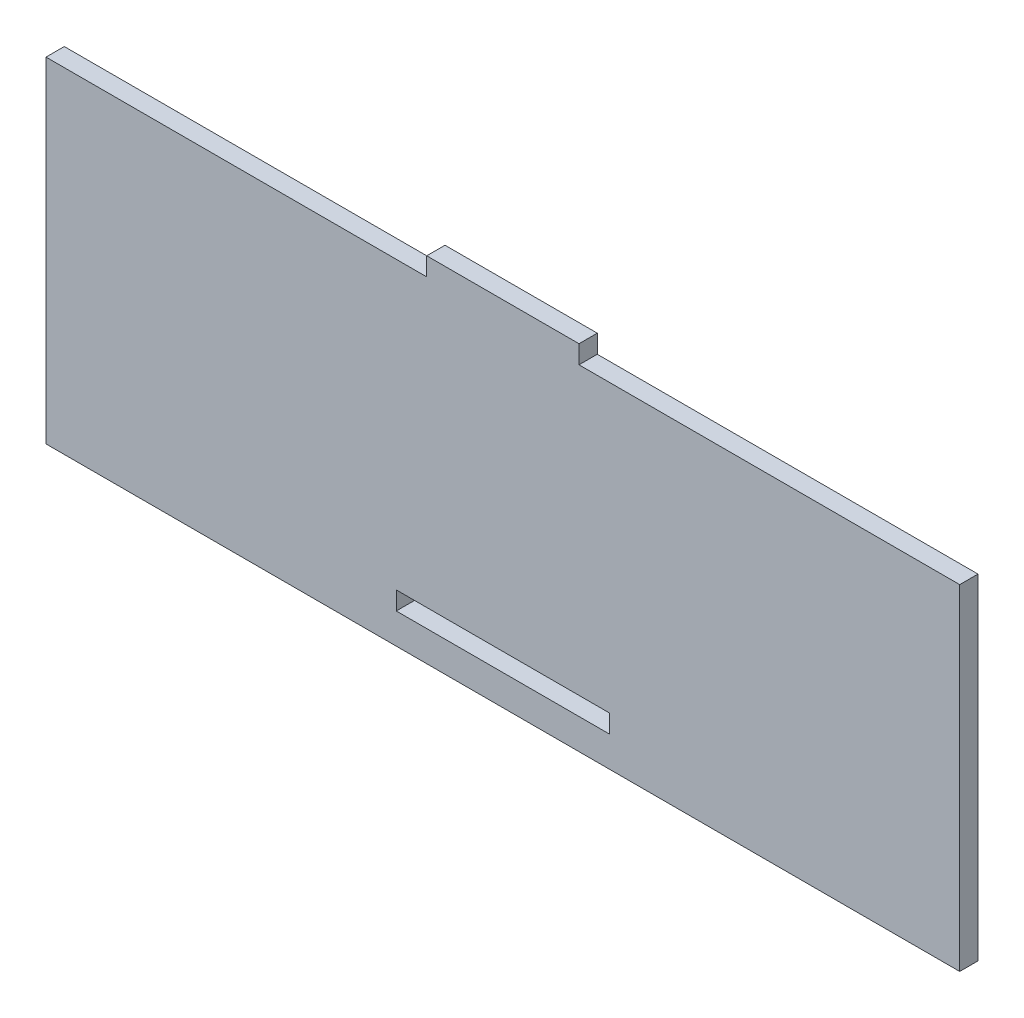
ISO-10303-21;
HEADER;
FILE_DESCRIPTION(('STEP AP214'),'2;1');
FILE_NAME('part.step','',(''),(''),'','','');
FILE_SCHEMA(('AUTOMOTIVE_DESIGN { 1 0 10303 214 1 1 1 1 }'));
ENDSEC;
DATA;
#1=APPLICATION_CONTEXT('core data for automotive mechanical design processes');
#2=APPLICATION_PROTOCOL_DEFINITION('international standard','automotive_design',2000,#1);
#3=PRODUCT_CONTEXT('',#1,'mechanical');
#4=PRODUCT('Part','Part','',(#3));
#5=PRODUCT_RELATED_PRODUCT_CATEGORY('part','',(#4));
#6=PRODUCT_DEFINITION_FORMATION('','',#4);
#7=PRODUCT_DEFINITION_CONTEXT('part definition',#1,'design');
#8=PRODUCT_DEFINITION('design','',#6,#7);
#9=PRODUCT_DEFINITION_SHAPE('','',#8);
#10=(LENGTH_UNIT() NAMED_UNIT(*) SI_UNIT(.MILLI.,.METRE.));
#11=(NAMED_UNIT(*) PLANE_ANGLE_UNIT() SI_UNIT($,.RADIAN.));
#12=(NAMED_UNIT(*) SI_UNIT($,.STERADIAN.) SOLID_ANGLE_UNIT());
#13=UNCERTAINTY_MEASURE_WITH_UNIT(LENGTH_MEASURE(1.E-05),#10,'distance_accuracy_value','');
#14=(GEOMETRIC_REPRESENTATION_CONTEXT(3) GLOBAL_UNCERTAINTY_ASSIGNED_CONTEXT((#13)) GLOBAL_UNIT_ASSIGNED_CONTEXT((#10,
#11,#12)) REPRESENTATION_CONTEXT('',''));
#15=CARTESIAN_POINT('',(0.,0.,0.));
#16=DIRECTION('',(0.,0.,1.));
#17=DIRECTION('',(1.,0.,0.));
#18=AXIS2_PLACEMENT_3D('',#15,#16,#17);
#19=CARTESIAN_POINT('',(0.,0.,3.));
#20=DIRECTION('',(0.,0.,1.));
#21=DIRECTION('',(1.,0.,0.));
#22=AXIS2_PLACEMENT_3D('',#19,#20,#21);
#23=PLANE('',#22);
#24=DIRECTION('',(0.,-1.,0.));
#25=VECTOR('',#24,1.);
#26=CARTESIAN_POINT('',(-73.2843137254903,61.3464052287582,3.));
#27=LINE('',#26,#25);
#28=CARTESIAN_POINT('',(-73.2843137254903,61.3464052287582,3.));
#29=VERTEX_POINT('',#28);
#30=CARTESIAN_POINT('',(-73.2843137254903,6.3464052287582,3.));
#31=VERTEX_POINT('',#30);
#32=EDGE_CURVE('E158',#29,#31,#27,.T.);
#33=ORIENTED_EDGE('',*,*,#32,.T.);
#34=DIRECTION('',(1.,0.,0.));
#35=VECTOR('',#34,1.);
#36=CARTESIAN_POINT('',(-73.2843137254903,6.3464052287582,3.));
#37=LINE('',#36,#35);
#38=CARTESIAN_POINT('',(76.7156862745097,6.3464052287582,3.));
#39=VERTEX_POINT('',#38);
#40=EDGE_CURVE('E161',#31,#39,#37,.T.);
#41=ORIENTED_EDGE('',*,*,#40,.T.);
#42=DIRECTION('',(0.,1.,0.));
#43=VECTOR('',#42,1.);
#44=CARTESIAN_POINT('',(76.7156862745097,61.3464052287582,3.));
#45=LINE('',#44,#43);
#46=CARTESIAN_POINT('',(76.7156862745097,61.3464052287582,3.));
#47=VERTEX_POINT('',#46);
#48=EDGE_CURVE('E164',#39,#47,#45,.T.);
#49=ORIENTED_EDGE('',*,*,#48,.T.);
#50=DIRECTION('',(-1.,0.,0.));
#51=VECTOR('',#50,1.);
#52=CARTESIAN_POINT('',(14.2156862745097,61.3464052287582,3.));
#53=LINE('',#52,#51);
#54=CARTESIAN_POINT('',(14.2156862745097,61.3464052287582,3.));
#55=VERTEX_POINT('',#54);
#56=EDGE_CURVE('E166',#47,#55,#53,.T.);
#57=ORIENTED_EDGE('',*,*,#56,.T.);
#58=DIRECTION('',(0.,1.,0.));
#59=VECTOR('',#58,1.);
#60=CARTESIAN_POINT('',(14.2156862745097,61.3464052287582,3.));
#61=LINE('',#60,#59);
#62=CARTESIAN_POINT('',(14.2156862745097,64.3464052287582,3.));
#63=VERTEX_POINT('',#62);
#64=EDGE_CURVE('E168',#55,#63,#61,.T.);
#65=ORIENTED_EDGE('',*,*,#64,.T.);
#66=DIRECTION('',(-1.,0.,0.));
#67=VECTOR('',#66,1.);
#68=CARTESIAN_POINT('',(-10.7843137254903,64.3464052287582,3.));
#69=LINE('',#68,#67);
#70=CARTESIAN_POINT('',(-10.7843137254903,64.3464052287582,3.));
#71=VERTEX_POINT('',#70);
#72=EDGE_CURVE('E170',#63,#71,#69,.T.);
#73=ORIENTED_EDGE('',*,*,#72,.T.);
#74=DIRECTION('',(0.,-1.,0.));
#75=VECTOR('',#74,1.);
#76=CARTESIAN_POINT('',(-10.7843137254903,61.3464052287582,3.));
#77=LINE('',#76,#75);
#78=CARTESIAN_POINT('',(-10.7843137254903,61.3464052287582,3.));
#79=VERTEX_POINT('',#78);
#80=EDGE_CURVE('E172',#71,#79,#77,.T.);
#81=ORIENTED_EDGE('',*,*,#80,.T.);
#82=DIRECTION('',(-1.,0.,0.));
#83=VECTOR('',#82,1.);
#84=CARTESIAN_POINT('',(-73.2843137254903,61.3464052287582,3.));
#85=LINE('',#84,#83);
#86=EDGE_CURVE('E174',#79,#29,#85,.T.);
#87=ORIENTED_EDGE('',*,*,#86,.T.);
#88=EDGE_LOOP('',(#33,#41,#49,#57,#65,#73,#81,#87));
#89=FACE_BOUND('',#88,.T.);
#90=DIRECTION('',(1.,0.,0.));
#91=VECTOR('',#90,1.);
#92=CARTESIAN_POINT('',(-15.7843137254903,11.3464052287582,3.));
#93=LINE('',#92,#91);
#94=CARTESIAN_POINT('',(-15.7843137254903,11.3464052287582,3.));
#95=VERTEX_POINT('',#94);
#96=CARTESIAN_POINT('',(19.2156862745097,11.3464052287582,3.));
#97=VERTEX_POINT('',#96);
#98=EDGE_CURVE('E130',#95,#97,#93,.T.);
#99=ORIENTED_EDGE('',*,*,#98,.F.);
#100=DIRECTION('',(0.,-1.,0.));
#101=VECTOR('',#100,1.);
#102=CARTESIAN_POINT('',(-15.7843137254903,11.3464052287582,3.));
#103=LINE('',#102,#101);
#104=CARTESIAN_POINT('',(-15.7843137254903,14.3464052287582,3.));
#105=VERTEX_POINT('',#104);
#106=EDGE_CURVE('E122',#105,#95,#103,.T.);
#107=ORIENTED_EDGE('',*,*,#106,.F.);
#108=DIRECTION('',(-1.,0.,0.));
#109=VECTOR('',#108,1.);
#110=CARTESIAN_POINT('',(-15.7843137254903,14.3464052287582,3.));
#111=LINE('',#110,#109);
#112=CARTESIAN_POINT('',(19.2156862745097,14.3464052287582,3.));
#113=VERTEX_POINT('',#112);
#114=EDGE_CURVE('E144',#113,#105,#111,.T.);
#115=ORIENTED_EDGE('',*,*,#114,.F.);
#116=DIRECTION('',(0.,1.,0.));
#117=VECTOR('',#116,1.);
#118=CARTESIAN_POINT('',(19.2156862745097,11.3464052287582,3.));
#119=LINE('',#118,#117);
#120=EDGE_CURVE('E142',#97,#113,#119,.T.);
#121=ORIENTED_EDGE('',*,*,#120,.F.);
#122=EDGE_LOOP('',(#99,#107,#115,#121));
#123=FACE_BOUND('',#122,.T.);
#124=ADVANCED_FACE('F33',(#89,#123),#23,.T.);
#125=CARTESIAN_POINT('',(0.,0.,0.));
#126=DIRECTION('',(0.,0.,1.));
#127=DIRECTION('',(1.,0.,0.));
#128=AXIS2_PLACEMENT_3D('',#125,#126,#127);
#129=PLANE('',#128);
#130=DIRECTION('',(0.,-1.,0.));
#131=VECTOR('',#130,1.);
#132=CARTESIAN_POINT('',(-73.2843137254903,61.3464052287582,0.));
#133=LINE('',#132,#131);
#134=CARTESIAN_POINT('',(-73.2843137254903,61.3464052287582,0.));
#135=VERTEX_POINT('',#134);
#136=CARTESIAN_POINT('',(-73.2843137254903,6.3464052287582,0.));
#137=VERTEX_POINT('',#136);
#138=EDGE_CURVE('E138',#135,#137,#133,.T.);
#139=ORIENTED_EDGE('',*,*,#138,.F.);
#140=DIRECTION('',(-1.,0.,0.));
#141=VECTOR('',#140,1.);
#142=CARTESIAN_POINT('',(-73.2843137254903,61.3464052287582,0.));
#143=LINE('',#142,#141);
#144=CARTESIAN_POINT('',(-10.7843137254903,61.3464052287582,0.));
#145=VERTEX_POINT('',#144);
#146=EDGE_CURVE('E162',#145,#135,#143,.T.);
#147=ORIENTED_EDGE('',*,*,#146,.F.);
#148=DIRECTION('',(0.,-1.,0.));
#149=VECTOR('',#148,1.);
#150=CARTESIAN_POINT('',(-10.7843137254903,61.3464052287582,0.));
#151=LINE('',#150,#149);
#152=CARTESIAN_POINT('',(-10.7843137254903,64.3464052287582,0.));
#153=VERTEX_POINT('',#152);
#154=EDGE_CURVE('E189',#153,#145,#151,.T.);
#155=ORIENTED_EDGE('',*,*,#154,.F.);
#156=DIRECTION('',(-1.,0.,0.));
#157=VECTOR('',#156,1.);
#158=CARTESIAN_POINT('',(-10.7843137254903,64.3464052287582,0.));
#159=LINE('',#158,#157);
#160=CARTESIAN_POINT('',(14.2156862745097,64.3464052287582,0.));
#161=VERTEX_POINT('',#160);
#162=EDGE_CURVE('E187',#161,#153,#159,.T.);
#163=ORIENTED_EDGE('',*,*,#162,.F.);
#164=DIRECTION('',(0.,1.,0.));
#165=VECTOR('',#164,1.);
#166=CARTESIAN_POINT('',(14.2156862745097,61.3464052287582,0.));
#167=LINE('',#166,#165);
#168=CARTESIAN_POINT('',(14.2156862745097,61.3464052287582,0.));
#169=VERTEX_POINT('',#168);
#170=EDGE_CURVE('E185',#169,#161,#167,.T.);
#171=ORIENTED_EDGE('',*,*,#170,.F.);
#172=DIRECTION('',(-1.,0.,0.));
#173=VECTOR('',#172,1.);
#174=CARTESIAN_POINT('',(14.2156862745097,61.3464052287582,0.));
#175=LINE('',#174,#173);
#176=CARTESIAN_POINT('',(76.7156862745097,61.3464052287582,0.));
#177=VERTEX_POINT('',#176);
#178=EDGE_CURVE('E183',#177,#169,#175,.T.);
#179=ORIENTED_EDGE('',*,*,#178,.F.);
#180=DIRECTION('',(0.,1.,0.));
#181=VECTOR('',#180,1.);
#182=CARTESIAN_POINT('',(76.7156862745097,61.3464052287582,0.));
#183=LINE('',#182,#181);
#184=CARTESIAN_POINT('',(76.7156862745097,6.3464052287582,0.));
#185=VERTEX_POINT('',#184);
#186=EDGE_CURVE('E181',#185,#177,#183,.T.);
#187=ORIENTED_EDGE('',*,*,#186,.F.);
#188=DIRECTION('',(1.,0.,0.));
#189=VECTOR('',#188,1.);
#190=CARTESIAN_POINT('',(-73.2843137254903,6.3464052287582,0.));
#191=LINE('',#190,#189);
#192=EDGE_CURVE('E179',#137,#185,#191,.T.);
#193=ORIENTED_EDGE('',*,*,#192,.F.);
#194=EDGE_LOOP('',(#139,#147,#155,#163,#171,#179,#187,#193));
#195=FACE_BOUND('',#194,.T.);
#196=DIRECTION('',(0.,-1.,0.));
#197=VECTOR('',#196,1.);
#198=CARTESIAN_POINT('',(-15.7843137254903,11.3464052287582,0.));
#199=LINE('',#198,#197);
#200=CARTESIAN_POINT('',(-15.7843137254903,14.3464052287582,0.));
#201=VERTEX_POINT('',#200);
#202=CARTESIAN_POINT('',(-15.7843137254903,11.3464052287582,0.));
#203=VERTEX_POINT('',#202);
#204=EDGE_CURVE('E56',#201,#203,#199,.T.);
#205=ORIENTED_EDGE('',*,*,#204,.T.);
#206=DIRECTION('',(1.,0.,0.));
#207=VECTOR('',#206,1.);
#208=CARTESIAN_POINT('',(-15.7843137254903,11.3464052287582,0.));
#209=LINE('',#208,#207);
#210=CARTESIAN_POINT('',(19.2156862745097,11.3464052287582,0.));
#211=VERTEX_POINT('',#210);
#212=EDGE_CURVE('E137',#203,#211,#209,.T.);
#213=ORIENTED_EDGE('',*,*,#212,.T.);
#214=DIRECTION('',(0.,1.,0.));
#215=VECTOR('',#214,1.);
#216=CARTESIAN_POINT('',(19.2156862745097,11.3464052287582,0.));
#217=LINE('',#216,#215);
#218=CARTESIAN_POINT('',(19.2156862745097,14.3464052287582,0.));
#219=VERTEX_POINT('',#218);
#220=EDGE_CURVE('E150',#211,#219,#217,.T.);
#221=ORIENTED_EDGE('',*,*,#220,.T.);
#222=DIRECTION('',(-1.,0.,0.));
#223=VECTOR('',#222,1.);
#224=CARTESIAN_POINT('',(-15.7843137254903,14.3464052287582,0.));
#225=LINE('',#224,#223);
#226=EDGE_CURVE('E131',#219,#201,#225,.T.);
#227=ORIENTED_EDGE('',*,*,#226,.T.);
#228=EDGE_LOOP('',(#205,#213,#221,#227));
#229=FACE_BOUND('',#228,.T.);
#230=ADVANCED_FACE('F219',(#195,#229),#129,.F.);
#231=CARTESIAN_POINT('',(-73.2843137254903,61.3464052287582,3.));
#232=DIRECTION('',(1.,0.,0.));
#233=DIRECTION('',(0.,0.,-1.));
#234=AXIS2_PLACEMENT_3D('',#231,#232,#233);
#235=PLANE('',#234);
#236=ORIENTED_EDGE('',*,*,#138,.T.);
#237=DIRECTION('',(0.,0.,-1.));
#238=VECTOR('',#237,1.);
#239=CARTESIAN_POINT('',(-73.2843137254903,6.3464052287582,3.));
#240=LINE('',#239,#238);
#241=EDGE_CURVE('E11',#31,#137,#240,.T.);
#242=ORIENTED_EDGE('',*,*,#241,.F.);
#243=ORIENTED_EDGE('',*,*,#32,.F.);
#244=DIRECTION('',(0.,0.,-1.));
#245=VECTOR('',#244,1.);
#246=CARTESIAN_POINT('',(-73.2843137254903,61.3464052287582,3.));
#247=LINE('',#246,#245);
#248=EDGE_CURVE('E176',#29,#135,#247,.T.);
#249=ORIENTED_EDGE('',*,*,#248,.T.);
#250=EDGE_LOOP('',(#236,#242,#243,#249));
#251=FACE_BOUND('',#250,.T.);
#252=ADVANCED_FACE('F35',(#251),#235,.F.);
#253=CARTESIAN_POINT('',(-73.2843137254903,6.3464052287582,3.));
#254=DIRECTION('',(0.,1.,0.));
#255=DIRECTION('',(-1.,0.,0.));
#256=AXIS2_PLACEMENT_3D('',#253,#254,#255);
#257=PLANE('',#256);
#258=ORIENTED_EDGE('',*,*,#192,.T.);
#259=DIRECTION('',(0.,0.,-1.));
#260=VECTOR('',#259,1.);
#261=CARTESIAN_POINT('',(76.7156862745097,6.3464052287582,3.));
#262=LINE('',#261,#260);
#263=EDGE_CURVE('E41',#39,#185,#262,.T.);
#264=ORIENTED_EDGE('',*,*,#263,.F.);
#265=ORIENTED_EDGE('',*,*,#40,.F.);
#266=ORIENTED_EDGE('',*,*,#241,.T.);
#267=EDGE_LOOP('',(#258,#264,#265,#266));
#268=FACE_BOUND('',#267,.T.);
#269=ADVANCED_FACE('F236',(#268),#257,.F.);
#270=CARTESIAN_POINT('',(76.7156862745097,61.3464052287582,3.));
#271=DIRECTION('',(-1.,0.,0.));
#272=DIRECTION('',(0.,0.,1.));
#273=AXIS2_PLACEMENT_3D('',#270,#271,#272);
#274=PLANE('',#273);
#275=ORIENTED_EDGE('',*,*,#186,.T.);
#276=DIRECTION('',(0.,0.,-1.));
#277=VECTOR('',#276,1.);
#278=CARTESIAN_POINT('',(76.7156862745097,61.3464052287582,3.));
#279=LINE('',#278,#277);
#280=EDGE_CURVE('E206',#47,#177,#279,.T.);
#281=ORIENTED_EDGE('',*,*,#280,.F.);
#282=ORIENTED_EDGE('',*,*,#48,.F.);
#283=ORIENTED_EDGE('',*,*,#263,.T.);
#284=EDGE_LOOP('',(#275,#281,#282,#283));
#285=FACE_BOUND('',#284,.T.);
#286=ADVANCED_FACE('F213',(#285),#274,.F.);
#287=CARTESIAN_POINT('',(14.2156862745097,61.3464052287582,3.));
#288=DIRECTION('',(0.,-1.,0.));
#289=DIRECTION('',(0.,0.,-1.));
#290=AXIS2_PLACEMENT_3D('',#287,#288,#289);
#291=PLANE('',#290);
#292=ORIENTED_EDGE('',*,*,#178,.T.);
#293=DIRECTION('',(0.,0.,-1.));
#294=VECTOR('',#293,1.);
#295=CARTESIAN_POINT('',(14.2156862745097,61.3464052287582,3.));
#296=LINE('',#295,#294);
#297=EDGE_CURVE('E203',#55,#169,#296,.T.);
#298=ORIENTED_EDGE('',*,*,#297,.F.);
#299=ORIENTED_EDGE('',*,*,#56,.F.);
#300=ORIENTED_EDGE('',*,*,#280,.T.);
#301=EDGE_LOOP('',(#292,#298,#299,#300));
#302=FACE_BOUND('',#301,.T.);
#303=ADVANCED_FACE('F225',(#302),#291,.F.);
#304=CARTESIAN_POINT('',(14.2156862745097,61.3464052287582,3.));
#305=DIRECTION('',(-1.,0.,0.));
#306=DIRECTION('',(0.,0.,1.));
#307=AXIS2_PLACEMENT_3D('',#304,#305,#306);
#308=PLANE('',#307);
#309=ORIENTED_EDGE('',*,*,#170,.T.);
#310=DIRECTION('',(0.,0.,-1.));
#311=VECTOR('',#310,1.);
#312=CARTESIAN_POINT('',(14.2156862745097,64.3464052287582,3.));
#313=LINE('',#312,#311);
#314=EDGE_CURVE('E200',#63,#161,#313,.T.);
#315=ORIENTED_EDGE('',*,*,#314,.F.);
#316=ORIENTED_EDGE('',*,*,#64,.F.);
#317=ORIENTED_EDGE('',*,*,#297,.T.);
#318=EDGE_LOOP('',(#309,#315,#316,#317));
#319=FACE_BOUND('',#318,.T.);
#320=ADVANCED_FACE('F229',(#319),#308,.F.);
#321=CARTESIAN_POINT('',(-10.7843137254903,64.3464052287582,3.));
#322=DIRECTION('',(0.,-1.,0.));
#323=DIRECTION('',(0.,0.,-1.));
#324=AXIS2_PLACEMENT_3D('',#321,#322,#323);
#325=PLANE('',#324);
#326=ORIENTED_EDGE('',*,*,#162,.T.);
#327=DIRECTION('',(0.,0.,-1.));
#328=VECTOR('',#327,1.);
#329=CARTESIAN_POINT('',(-10.7843137254903,64.3464052287582,3.));
#330=LINE('',#329,#328);
#331=EDGE_CURVE('E197',#71,#153,#330,.T.);
#332=ORIENTED_EDGE('',*,*,#331,.F.);
#333=ORIENTED_EDGE('',*,*,#72,.F.);
#334=ORIENTED_EDGE('',*,*,#314,.T.);
#335=EDGE_LOOP('',(#326,#332,#333,#334));
#336=FACE_BOUND('',#335,.T.);
#337=ADVANCED_FACE('F249',(#336),#325,.F.);
#338=CARTESIAN_POINT('',(-10.7843137254903,61.3464052287582,3.));
#339=DIRECTION('',(1.,0.,0.));
#340=DIRECTION('',(0.,0.,-1.));
#341=AXIS2_PLACEMENT_3D('',#338,#339,#340);
#342=PLANE('',#341);
#343=ORIENTED_EDGE('',*,*,#154,.T.);
#344=DIRECTION('',(0.,0.,-1.));
#345=VECTOR('',#344,1.);
#346=CARTESIAN_POINT('',(-10.7843137254903,61.3464052287582,3.));
#347=LINE('',#346,#345);
#348=EDGE_CURVE('E194',#79,#145,#347,.T.);
#349=ORIENTED_EDGE('',*,*,#348,.F.);
#350=ORIENTED_EDGE('',*,*,#80,.F.);
#351=ORIENTED_EDGE('',*,*,#331,.T.);
#352=EDGE_LOOP('',(#343,#349,#350,#351));
#353=FACE_BOUND('',#352,.T.);
#354=ADVANCED_FACE('F247',(#353),#342,.F.);
#355=CARTESIAN_POINT('',(-73.2843137254903,61.3464052287582,3.));
#356=DIRECTION('',(0.,-1.,0.));
#357=DIRECTION('',(0.,0.,-1.));
#358=AXIS2_PLACEMENT_3D('',#355,#356,#357);
#359=PLANE('',#358);
#360=ORIENTED_EDGE('',*,*,#146,.T.);
#361=ORIENTED_EDGE('',*,*,#248,.F.);
#362=ORIENTED_EDGE('',*,*,#86,.F.);
#363=ORIENTED_EDGE('',*,*,#348,.T.);
#364=EDGE_LOOP('',(#360,#361,#362,#363));
#365=FACE_BOUND('',#364,.T.);
#366=ADVANCED_FACE('F242',(#365),#359,.F.);
#367=CARTESIAN_POINT('',(-15.7843137254903,11.3464052287582,3.));
#368=DIRECTION('',(1.,0.,0.));
#369=DIRECTION('',(0.,0.,-1.));
#370=AXIS2_PLACEMENT_3D('',#367,#368,#369);
#371=PLANE('',#370);
#372=ORIENTED_EDGE('',*,*,#204,.F.);
#373=DIRECTION('',(0.,0.,-1.));
#374=VECTOR('',#373,1.);
#375=CARTESIAN_POINT('',(-15.7843137254903,14.3464052287582,3.));
#376=LINE('',#375,#374);
#377=EDGE_CURVE('E126',#105,#201,#376,.T.);
#378=ORIENTED_EDGE('',*,*,#377,.F.);
#379=ORIENTED_EDGE('',*,*,#106,.T.);
#380=DIRECTION('',(0.,0.,-1.));
#381=VECTOR('',#380,1.);
#382=CARTESIAN_POINT('',(-15.7843137254903,11.3464052287582,3.));
#383=LINE('',#382,#381);
#384=EDGE_CURVE('E125',#95,#203,#383,.T.);
#385=ORIENTED_EDGE('',*,*,#384,.T.);
#386=EDGE_LOOP('',(#372,#378,#379,#385));
#387=FACE_BOUND('',#386,.T.);
#388=ADVANCED_FACE('F124',(#387),#371,.T.);
#389=CARTESIAN_POINT('',(-15.7843137254903,11.3464052287582,3.));
#390=DIRECTION('',(0.,1.,0.));
#391=DIRECTION('',(-1.,0.,0.));
#392=AXIS2_PLACEMENT_3D('',#389,#390,#391);
#393=PLANE('',#392);
#394=ORIENTED_EDGE('',*,*,#212,.F.);
#395=ORIENTED_EDGE('',*,*,#384,.F.);
#396=ORIENTED_EDGE('',*,*,#98,.T.);
#397=DIRECTION('',(0.,0.,-1.));
#398=VECTOR('',#397,1.);
#399=CARTESIAN_POINT('',(19.2156862745097,11.3464052287582,3.));
#400=LINE('',#399,#398);
#401=EDGE_CURVE('E139',#97,#211,#400,.T.);
#402=ORIENTED_EDGE('',*,*,#401,.T.);
#403=EDGE_LOOP('',(#394,#395,#396,#402));
#404=FACE_BOUND('',#403,.T.);
#405=ADVANCED_FACE('F134',(#404),#393,.T.);
#406=CARTESIAN_POINT('',(19.2156862745097,11.3464052287582,3.));
#407=DIRECTION('',(-1.,0.,0.));
#408=DIRECTION('',(0.,0.,1.));
#409=AXIS2_PLACEMENT_3D('',#406,#407,#408);
#410=PLANE('',#409);
#411=ORIENTED_EDGE('',*,*,#220,.F.);
#412=ORIENTED_EDGE('',*,*,#401,.F.);
#413=ORIENTED_EDGE('',*,*,#120,.T.);
#414=DIRECTION('',(0.,0.,-1.));
#415=VECTOR('',#414,1.);
#416=CARTESIAN_POINT('',(19.2156862745097,14.3464052287582,3.));
#417=LINE('',#416,#415);
#418=EDGE_CURVE('E48',#113,#219,#417,.T.);
#419=ORIENTED_EDGE('',*,*,#418,.T.);
#420=EDGE_LOOP('',(#411,#412,#413,#419));
#421=FACE_BOUND('',#420,.T.);
#422=ADVANCED_FACE('F274',(#421),#410,.T.);
#423=CARTESIAN_POINT('',(-15.7843137254903,14.3464052287582,3.));
#424=DIRECTION('',(0.,-1.,0.));
#425=DIRECTION('',(1.,0.,0.));
#426=AXIS2_PLACEMENT_3D('',#423,#424,#425);
#427=PLANE('',#426);
#428=ORIENTED_EDGE('',*,*,#226,.F.);
#429=ORIENTED_EDGE('',*,*,#418,.F.);
#430=ORIENTED_EDGE('',*,*,#114,.T.);
#431=ORIENTED_EDGE('',*,*,#377,.T.);
#432=EDGE_LOOP('',(#428,#429,#430,#431));
#433=FACE_BOUND('',#432,.T.);
#434=ADVANCED_FACE('F278',(#433),#427,.T.);
#435=CLOSED_SHELL('',(#124,#230,#252,#269,#286,#303,#320,#337,#354,#366,#388,#405,#422,#434));
#436=MANIFOLD_SOLID_BREP('B2',#435);
#437=ADVANCED_BREP_SHAPE_REPRESENTATION('',(#18,#436),#14);
#438=SHAPE_DEFINITION_REPRESENTATION(#9,#437);
ENDSEC;
END-ISO-10303-21;
